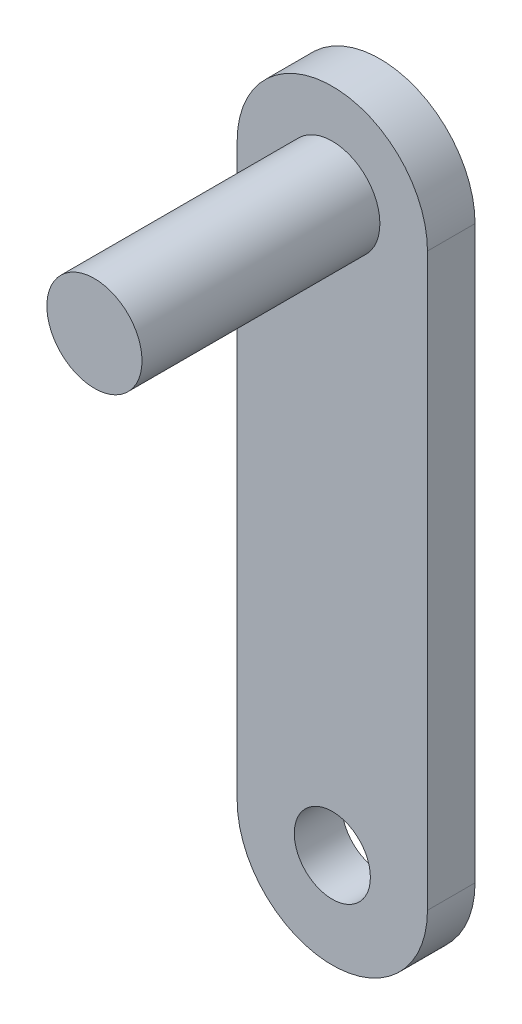
ISO-10303-21;
HEADER;
FILE_DESCRIPTION(('STEP AP214'),'2;1');
FILE_NAME('part.step','',(''),(''),'','','');
FILE_SCHEMA(('AUTOMOTIVE_DESIGN { 1 0 10303 214 1 1 1 1 }'));
ENDSEC;
DATA;
#1=APPLICATION_CONTEXT('core data for automotive mechanical design processes');
#2=APPLICATION_PROTOCOL_DEFINITION('international standard','automotive_design',2000,#1);
#3=PRODUCT_CONTEXT('',#1,'mechanical');
#4=PRODUCT('Part','Part','',(#3));
#5=PRODUCT_RELATED_PRODUCT_CATEGORY('part','',(#4));
#6=PRODUCT_DEFINITION_FORMATION('','',#4);
#7=PRODUCT_DEFINITION_CONTEXT('part definition',#1,'design');
#8=PRODUCT_DEFINITION('design','',#6,#7);
#9=PRODUCT_DEFINITION_SHAPE('','',#8);
#10=(LENGTH_UNIT() NAMED_UNIT(*) SI_UNIT(.MILLI.,.METRE.));
#11=(NAMED_UNIT(*) PLANE_ANGLE_UNIT() SI_UNIT($,.RADIAN.));
#12=(NAMED_UNIT(*) SI_UNIT($,.STERADIAN.) SOLID_ANGLE_UNIT());
#13=UNCERTAINTY_MEASURE_WITH_UNIT(LENGTH_MEASURE(1.E-05),#10,'distance_accuracy_value','');
#14=(GEOMETRIC_REPRESENTATION_CONTEXT(3) GLOBAL_UNCERTAINTY_ASSIGNED_CONTEXT((#13)) GLOBAL_UNIT_ASSIGNED_CONTEXT((#10,
#11,#12)) REPRESENTATION_CONTEXT('',''));
#15=CARTESIAN_POINT('',(0.,0.,0.));
#16=DIRECTION('',(0.,0.,1.));
#17=DIRECTION('',(1.,0.,0.));
#18=AXIS2_PLACEMENT_3D('',#15,#16,#17);
#19=CARTESIAN_POINT('',(0.,-30.,5.));
#20=DIRECTION('',(0.,0.,1.));
#21=DIRECTION('',(1.,0.,0.));
#22=AXIS2_PLACEMENT_3D('',#19,#20,#21);
#23=PLANE('',#22);
#24=CARTESIAN_POINT('',(0.,30.,5.));
#25=DIRECTION('',(0.,0.,1.));
#26=DIRECTION('',(1.,0.,0.));
#27=AXIS2_PLACEMENT_3D('',#24,#25,#26);
#28=CIRCLE('',#27,5.00000000000001);
#29=CARTESIAN_POINT('',(5.00000000000001,30.,5.));
#30=VERTEX_POINT('',#29);
#31=EDGE_CURVE('E102',#30,#30,#28,.T.);
#32=ORIENTED_EDGE('',*,*,#31,.F.);
#33=EDGE_LOOP('',(#32));
#34=FACE_BOUND('',#33,.T.);
#35=CARTESIAN_POINT('',(0.,-30.,5.));
#36=DIRECTION('',(0.,0.,1.));
#37=DIRECTION('',(1.,0.,0.));
#38=AXIS2_PLACEMENT_3D('',#35,#36,#37);
#39=CIRCLE('',#38,10.);
#40=CARTESIAN_POINT('',(-10.,-30.,5.));
#41=VERTEX_POINT('',#40);
#42=CARTESIAN_POINT('',(10.,-30.,5.));
#43=VERTEX_POINT('',#42);
#44=EDGE_CURVE('E87',#41,#43,#39,.T.);
#45=ORIENTED_EDGE('',*,*,#44,.T.);
#46=DIRECTION('',(0.,1.,0.));
#47=VECTOR('',#46,1.);
#48=CARTESIAN_POINT('',(10.,30.,5.));
#49=LINE('',#48,#47);
#50=CARTESIAN_POINT('',(10.,30.,5.));
#51=VERTEX_POINT('',#50);
#52=EDGE_CURVE('E82',#43,#51,#49,.T.);
#53=ORIENTED_EDGE('',*,*,#52,.T.);
#54=CARTESIAN_POINT('',(0.,30.,5.));
#55=DIRECTION('',(0.,0.,1.));
#56=DIRECTION('',(-1.,0.,0.));
#57=AXIS2_PLACEMENT_3D('',#54,#55,#56);
#58=CIRCLE('',#57,10.);
#59=CARTESIAN_POINT('',(-10.,30.,5.));
#60=VERTEX_POINT('',#59);
#61=EDGE_CURVE('E85',#51,#60,#58,.T.);
#62=ORIENTED_EDGE('',*,*,#61,.T.);
#63=DIRECTION('',(0.,-1.,0.));
#64=VECTOR('',#63,1.);
#65=CARTESIAN_POINT('',(-10.,30.,5.));
#66=LINE('',#65,#64);
#67=EDGE_CURVE('E52',#60,#41,#66,.T.);
#68=ORIENTED_EDGE('',*,*,#67,.T.);
#69=EDGE_LOOP('',(#45,#53,#62,#68));
#70=FACE_BOUND('',#69,.T.);
#71=CARTESIAN_POINT('',(0.,-30.,5.));
#72=DIRECTION('',(0.,0.,1.));
#73=DIRECTION('',(1.,0.,0.));
#74=AXIS2_PLACEMENT_3D('',#71,#72,#73);
#75=CIRCLE('',#74,4.);
#76=CARTESIAN_POINT('',(4.00000000000001,-30.,5.));
#77=VERTEX_POINT('',#76);
#78=EDGE_CURVE('E116',#77,#77,#75,.T.);
#79=ORIENTED_EDGE('',*,*,#78,.F.);
#80=EDGE_LOOP('',(#79));
#81=FACE_BOUND('',#80,.T.);
#82=ADVANCED_FACE('F35',(#34,#70,#81),#23,.T.);
#83=CARTESIAN_POINT('',(0.,-30.,0.));
#84=DIRECTION('',(0.,0.,1.));
#85=DIRECTION('',(1.,0.,0.));
#86=AXIS2_PLACEMENT_3D('',#83,#84,#85);
#87=PLANE('',#86);
#88=CARTESIAN_POINT('',(0.,-30.,0.));
#89=DIRECTION('',(0.,0.,1.));
#90=DIRECTION('',(1.,0.,0.));
#91=AXIS2_PLACEMENT_3D('',#88,#89,#90);
#92=CIRCLE('',#91,10.);
#93=CARTESIAN_POINT('',(-10.,-30.,0.));
#94=VERTEX_POINT('',#93);
#95=CARTESIAN_POINT('',(10.,-30.,0.));
#96=VERTEX_POINT('',#95);
#97=EDGE_CURVE('E99',#94,#96,#92,.T.);
#98=ORIENTED_EDGE('',*,*,#97,.F.);
#99=DIRECTION('',(0.,-1.,0.));
#100=VECTOR('',#99,1.);
#101=CARTESIAN_POINT('',(-10.,30.,0.));
#102=LINE('',#101,#100);
#103=CARTESIAN_POINT('',(-10.,30.,0.));
#104=VERTEX_POINT('',#103);
#105=EDGE_CURVE('E75',#104,#94,#102,.T.);
#106=ORIENTED_EDGE('',*,*,#105,.F.);
#107=CARTESIAN_POINT('',(0.,30.,0.));
#108=DIRECTION('',(0.,0.,1.));
#109=DIRECTION('',(-1.,0.,0.));
#110=AXIS2_PLACEMENT_3D('',#107,#108,#109);
#111=CIRCLE('',#110,10.);
#112=CARTESIAN_POINT('',(10.,30.,0.));
#113=VERTEX_POINT('',#112);
#114=EDGE_CURVE('E69',#113,#104,#111,.T.);
#115=ORIENTED_EDGE('',*,*,#114,.F.);
#116=DIRECTION('',(0.,1.,0.));
#117=VECTOR('',#116,1.);
#118=CARTESIAN_POINT('',(10.,30.,0.));
#119=LINE('',#118,#117);
#120=EDGE_CURVE('E91',#96,#113,#119,.T.);
#121=ORIENTED_EDGE('',*,*,#120,.F.);
#122=EDGE_LOOP('',(#98,#106,#115,#121));
#123=FACE_BOUND('',#122,.T.);
#124=CARTESIAN_POINT('',(0.,-30.,0.));
#125=DIRECTION('',(0.,0.,1.));
#126=DIRECTION('',(1.,0.,0.));
#127=AXIS2_PLACEMENT_3D('',#124,#125,#126);
#128=CIRCLE('',#127,4.);
#129=CARTESIAN_POINT('',(4.00000000000001,-30.,0.));
#130=VERTEX_POINT('',#129);
#131=EDGE_CURVE('E117',#130,#130,#128,.T.);
#132=ORIENTED_EDGE('',*,*,#131,.T.);
#133=EDGE_LOOP('',(#132));
#134=FACE_BOUND('',#133,.T.);
#135=ADVANCED_FACE('F110',(#123,#134),#87,.F.);
#136=CARTESIAN_POINT('',(0.,-30.,5.));
#137=DIRECTION('',(0.,0.,-1.));
#138=DIRECTION('',(-1.,0.,0.));
#139=AXIS2_PLACEMENT_3D('',#136,#137,#138);
#140=CYLINDRICAL_SURFACE('',#139,10.);
#141=ORIENTED_EDGE('',*,*,#97,.T.);
#142=DIRECTION('',(0.,0.,-1.));
#143=VECTOR('',#142,1.);
#144=CARTESIAN_POINT('',(10.,-30.,5.));
#145=LINE('',#144,#143);
#146=EDGE_CURVE('E11',#43,#96,#145,.T.);
#147=ORIENTED_EDGE('',*,*,#146,.F.);
#148=ORIENTED_EDGE('',*,*,#44,.F.);
#149=DIRECTION('',(0.,0.,-1.));
#150=VECTOR('',#149,1.);
#151=CARTESIAN_POINT('',(-10.,-30.,5.));
#152=LINE('',#151,#150);
#153=EDGE_CURVE('E95',#41,#94,#152,.T.);
#154=ORIENTED_EDGE('',*,*,#153,.T.);
#155=EDGE_LOOP('',(#141,#147,#148,#154));
#156=FACE_BOUND('',#155,.T.);
#157=ADVANCED_FACE('F37',(#156),#140,.T.);
#158=CARTESIAN_POINT('',(10.,30.,5.));
#159=DIRECTION('',(-1.,0.,0.));
#160=DIRECTION('',(0.,-1.,0.));
#161=AXIS2_PLACEMENT_3D('',#158,#159,#160);
#162=PLANE('',#161);
#163=ORIENTED_EDGE('',*,*,#120,.T.);
#164=DIRECTION('',(0.,0.,-1.));
#165=VECTOR('',#164,1.);
#166=CARTESIAN_POINT('',(10.,30.,5.));
#167=LINE('',#166,#165);
#168=EDGE_CURVE('E44',#51,#113,#167,.T.);
#169=ORIENTED_EDGE('',*,*,#168,.F.);
#170=ORIENTED_EDGE('',*,*,#52,.F.);
#171=ORIENTED_EDGE('',*,*,#146,.T.);
#172=EDGE_LOOP('',(#163,#169,#170,#171));
#173=FACE_BOUND('',#172,.T.);
#174=ADVANCED_FACE('F90',(#173),#162,.F.);
#175=CARTESIAN_POINT('',(0.,30.,5.));
#176=DIRECTION('',(0.,0.,-1.));
#177=DIRECTION('',(-1.,0.,0.));
#178=AXIS2_PLACEMENT_3D('',#175,#176,#177);
#179=CYLINDRICAL_SURFACE('',#178,10.);
#180=ORIENTED_EDGE('',*,*,#114,.T.);
#181=DIRECTION('',(0.,0.,-1.));
#182=VECTOR('',#181,1.);
#183=CARTESIAN_POINT('',(-10.,30.,5.));
#184=LINE('',#183,#182);
#185=EDGE_CURVE('E92',#60,#104,#184,.T.);
#186=ORIENTED_EDGE('',*,*,#185,.F.);
#187=ORIENTED_EDGE('',*,*,#61,.F.);
#188=ORIENTED_EDGE('',*,*,#168,.T.);
#189=EDGE_LOOP('',(#180,#186,#187,#188));
#190=FACE_BOUND('',#189,.T.);
#191=ADVANCED_FACE('F93',(#190),#179,.T.);
#192=CARTESIAN_POINT('',(-10.,30.,5.));
#193=DIRECTION('',(1.,0.,0.));
#194=DIRECTION('',(0.,1.,0.));
#195=AXIS2_PLACEMENT_3D('',#192,#193,#194);
#196=PLANE('',#195);
#197=ORIENTED_EDGE('',*,*,#105,.T.);
#198=ORIENTED_EDGE('',*,*,#153,.F.);
#199=ORIENTED_EDGE('',*,*,#67,.F.);
#200=ORIENTED_EDGE('',*,*,#185,.T.);
#201=EDGE_LOOP('',(#197,#198,#199,#200));
#202=FACE_BOUND('',#201,.T.);
#203=ADVANCED_FACE('F107',(#202),#196,.F.);
#204=CARTESIAN_POINT('',(0.,-30.,5.));
#205=DIRECTION('',(0.,0.,-1.));
#206=DIRECTION('',(-1.,0.,0.));
#207=AXIS2_PLACEMENT_3D('',#204,#205,#206);
#208=CYLINDRICAL_SURFACE('',#207,4.);
#209=ORIENTED_EDGE('',*,*,#78,.T.);
#210=EDGE_LOOP('',(#209));
#211=FACE_BOUND('',#210,.T.);
#212=ORIENTED_EDGE('',*,*,#131,.F.);
#213=EDGE_LOOP('',(#212));
#214=FACE_BOUND('',#213,.T.);
#215=ADVANCED_FACE('F130',(#211,#214),#208,.F.);
#216=CARTESIAN_POINT('',(0.,30.,30.));
#217=DIRECTION('',(0.,0.,-1.));
#218=DIRECTION('',(-1.,0.,0.));
#219=AXIS2_PLACEMENT_3D('',#216,#217,#218);
#220=CYLINDRICAL_SURFACE('',#219,5.00000000000001);
#221=ORIENTED_EDGE('',*,*,#31,.T.);
#222=EDGE_LOOP('',(#221));
#223=FACE_BOUND('',#222,.T.);
#224=CARTESIAN_POINT('',(0.,30.,30.));
#225=DIRECTION('',(0.,0.,1.));
#226=DIRECTION('',(1.,0.,0.));
#227=AXIS2_PLACEMENT_3D('',#224,#225,#226);
#228=CIRCLE('',#227,5.00000000000001);
#229=CARTESIAN_POINT('',(5.00000000000001,30.,30.));
#230=VERTEX_POINT('',#229);
#231=EDGE_CURVE('E120',#230,#230,#228,.T.);
#232=ORIENTED_EDGE('',*,*,#231,.F.);
#233=EDGE_LOOP('',(#232));
#234=FACE_BOUND('',#233,.T.);
#235=ADVANCED_FACE('F128',(#223,#234),#220,.T.);
#236=CARTESIAN_POINT('',(0.,0.,30.));
#237=DIRECTION('',(0.,0.,1.));
#238=DIRECTION('',(1.,0.,0.));
#239=AXIS2_PLACEMENT_3D('',#236,#237,#238);
#240=PLANE('',#239);
#241=ORIENTED_EDGE('',*,*,#231,.T.);
#242=EDGE_LOOP('',(#241));
#243=FACE_BOUND('',#242,.T.);
#244=ADVANCED_FACE('F126',(#243),#240,.T.);
#245=CLOSED_SHELL('',(#82,#135,#157,#174,#191,#203,#215,#235,#244));
#246=MANIFOLD_SOLID_BREP('B2',#245);
#247=ADVANCED_BREP_SHAPE_REPRESENTATION('',(#18,#246),#14);
#248=SHAPE_DEFINITION_REPRESENTATION(#9,#247);
ENDSEC;
END-ISO-10303-21;
